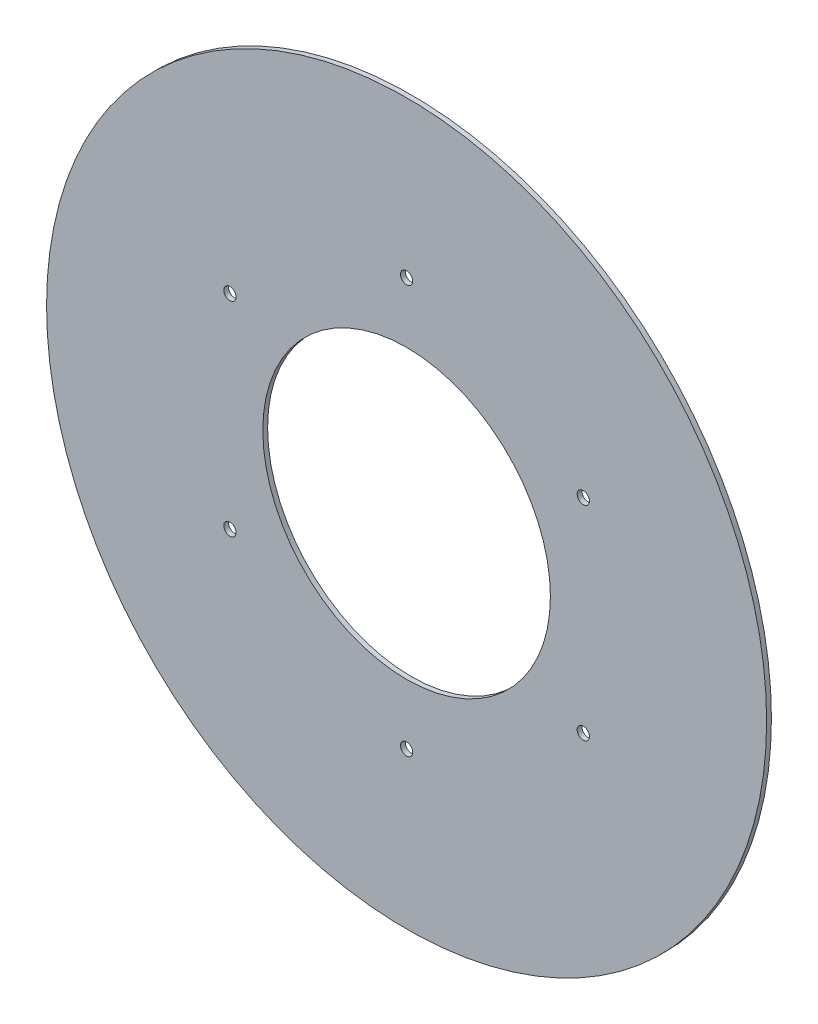
ISO-10303-21;
HEADER;
FILE_DESCRIPTION(('STEP AP214'),'2;1');
FILE_NAME('part.step','',(''),(''),'','','');
FILE_SCHEMA(('AUTOMOTIVE_DESIGN { 1 0 10303 214 1 1 1 1 }'));
ENDSEC;
DATA;
#1=APPLICATION_CONTEXT('core data for automotive mechanical design processes');
#2=APPLICATION_PROTOCOL_DEFINITION('international standard','automotive_design',2000,#1);
#3=PRODUCT_CONTEXT('',#1,'mechanical');
#4=PRODUCT('Part','Part','',(#3));
#5=PRODUCT_RELATED_PRODUCT_CATEGORY('part','',(#4));
#6=PRODUCT_DEFINITION_FORMATION('','',#4);
#7=PRODUCT_DEFINITION_CONTEXT('part definition',#1,'design');
#8=PRODUCT_DEFINITION('design','',#6,#7);
#9=PRODUCT_DEFINITION_SHAPE('','',#8);
#10=(LENGTH_UNIT() NAMED_UNIT(*) SI_UNIT(.MILLI.,.METRE.));
#11=(NAMED_UNIT(*) PLANE_ANGLE_UNIT() SI_UNIT($,.RADIAN.));
#12=(NAMED_UNIT(*) SI_UNIT($,.STERADIAN.) SOLID_ANGLE_UNIT());
#13=UNCERTAINTY_MEASURE_WITH_UNIT(LENGTH_MEASURE(1.E-05),#10,'distance_accuracy_value','');
#14=(GEOMETRIC_REPRESENTATION_CONTEXT(3) GLOBAL_UNCERTAINTY_ASSIGNED_CONTEXT((#13)) GLOBAL_UNIT_ASSIGNED_CONTEXT((#10,
#11,#12)) REPRESENTATION_CONTEXT('',''));
#15=CARTESIAN_POINT('',(0.,0.,0.));
#16=DIRECTION('',(0.,0.,1.));
#17=DIRECTION('',(1.,0.,0.));
#18=AXIS2_PLACEMENT_3D('',#15,#16,#17);
#19=CARTESIAN_POINT('',(0.,0.,513.500012931734));
#20=DIRECTION('',(0.,0.,-1.));
#21=DIRECTION('',(0.,-1.,0.));
#22=AXIS2_PLACEMENT_3D('',#19,#20,#21);
#23=PLANE('',#22);
#24=CARTESIAN_POINT('',(0.,0.,513.500012931734));
#25=DIRECTION('',(0.,0.,-1.));
#26=DIRECTION('',(1.,0.,0.));
#27=AXIS2_PLACEMENT_3D('',#24,#25,#26);
#28=CIRCLE('',#27,119.8125);
#29=CARTESIAN_POINT('',(-119.8125,0.,513.500012931734));
#30=VERTEX_POINT('',#29);
#31=EDGE_CURVE('E81',#30,#30,#28,.T.);
#32=ORIENTED_EDGE('',*,*,#31,.F.);
#33=EDGE_LOOP('',(#32));
#34=FACE_BOUND('',#33,.T.);
#35=CARTESIAN_POINT('',(-147.224319303959,-84.9999988558003,513.500013408569));
#36=DIRECTION('',(0.,0.,-1.));
#37=DIRECTION('',(1.,-7.77181222427865E-09,0.));
#38=AXIS2_PLACEMENT_3D('',#35,#36,#37);
#39=CIRCLE('',#38,5.1);
#40=CARTESIAN_POINT('',(-152.324319303959,-84.999998816164,513.500013408569));
#41=VERTEX_POINT('',#40);
#42=EDGE_CURVE('E62',#41,#41,#39,.T.);
#43=ORIENTED_EDGE('',*,*,#42,.F.);
#44=EDGE_LOOP('',(#43));
#45=FACE_BOUND('',#44,.T.);
#46=CARTESIAN_POINT('',(1.32120806739522E-06,170.,513.500013408569));
#47=DIRECTION('',(0.,0.,-1.));
#48=DIRECTION('',(1.,-7.77181222427866E-09,0.));
#49=AXIS2_PLACEMENT_3D('',#46,#47,#48);
#50=CIRCLE('',#49,5.1);
#51=CARTESIAN_POINT('',(-5.09999867879194,170.000000039636,513.500013408569));
#52=VERTEX_POINT('',#51);
#53=EDGE_CURVE('E134',#52,#52,#50,.T.);
#54=ORIENTED_EDGE('',*,*,#53,.F.);
#55=EDGE_LOOP('',(#54));
#56=FACE_BOUND('',#55,.T.);
#57=CARTESIAN_POINT('',(147.22431798275,-85.0000011441999,513.500013408569));
#58=DIRECTION('',(0.,0.,-1.));
#59=DIRECTION('',(1.,-7.77181222427865E-09,0.));
#60=AXIS2_PLACEMENT_3D('',#57,#58,#59);
#61=CIRCLE('',#60,5.1);
#62=CARTESIAN_POINT('',(142.12431798275,-85.0000011045636,513.500013408569));
#63=VERTEX_POINT('',#62);
#64=EDGE_CURVE('E119',#63,#63,#61,.T.);
#65=ORIENTED_EDGE('',*,*,#64,.F.);
#66=EDGE_LOOP('',(#65));
#67=FACE_BOUND('',#66,.T.);
#68=CARTESIAN_POINT('',(-1.32120811180414E-06,-170.,513.500013408569));
#69=DIRECTION('',(0.,0.,-1.));
#70=DIRECTION('',(1.,-7.77181222427866E-09,0.));
#71=AXIS2_PLACEMENT_3D('',#68,#69,#70);
#72=CIRCLE('',#71,5.1);
#73=CARTESIAN_POINT('',(-5.10000132120812,-169.999999960364,513.500013408569));
#74=VERTEX_POINT('',#73);
#75=EDGE_CURVE('E94',#74,#74,#72,.T.);
#76=ORIENTED_EDGE('',*,*,#75,.F.);
#77=EDGE_LOOP('',(#76));
#78=FACE_BOUND('',#77,.T.);
#79=CARTESIAN_POINT('',(-147.224317982751,85.0000011441997,513.500013408569));
#80=DIRECTION('',(0.,0.,-1.));
#81=DIRECTION('',(1.,-7.77181222427865E-09,0.));
#82=AXIS2_PLACEMENT_3D('',#79,#80,#81);
#83=CIRCLE('',#82,5.1);
#84=CARTESIAN_POINT('',(-152.324317982751,85.0000011838359,513.500013408569));
#85=VERTEX_POINT('',#84);
#86=EDGE_CURVE('E107',#85,#85,#83,.T.);
#87=ORIENTED_EDGE('',*,*,#86,.F.);
#88=EDGE_LOOP('',(#87));
#89=FACE_BOUND('',#88,.T.);
#90=CARTESIAN_POINT('',(147.224319303959,84.9999988558001,513.500013408569));
#91=DIRECTION('',(0.,0.,-1.));
#92=DIRECTION('',(1.,-7.77181222427865E-09,0.));
#93=AXIS2_PLACEMENT_3D('',#90,#91,#92);
#94=CIRCLE('',#93,5.1);
#95=CARTESIAN_POINT('',(142.124319303959,84.9999988954363,513.500013408569));
#96=VERTEX_POINT('',#95);
#97=EDGE_CURVE('E89',#96,#96,#94,.T.);
#98=ORIENTED_EDGE('',*,*,#97,.F.);
#99=EDGE_LOOP('',(#98));
#100=FACE_BOUND('',#99,.T.);
#101=CARTESIAN_POINT('',(0.,0.,513.500012931734));
#102=DIRECTION('',(0.,0.,1.));
#103=DIRECTION('',(-1.,0.,0.));
#104=AXIS2_PLACEMENT_3D('',#101,#102,#103);
#105=CIRCLE('',#104,300.);
#106=CARTESIAN_POINT('',(300.,0.,513.500012931734));
#107=VERTEX_POINT('',#106);
#108=EDGE_CURVE('E11',#107,#107,#105,.T.);
#109=ORIENTED_EDGE('',*,*,#108,.F.);
#110=EDGE_LOOP('',(#109));
#111=FACE_BOUND('',#110,.T.);
#112=ADVANCED_FACE('F17',(#34,#45,#56,#67,#78,#89,#100,#111),#23,.T.);
#113=CARTESIAN_POINT('',(0.,0.,517.500012931734));
#114=DIRECTION('',(0.,0.,-1.));
#115=DIRECTION('',(0.,-1.,0.));
#116=AXIS2_PLACEMENT_3D('',#113,#114,#115);
#117=PLANE('',#116);
#118=CARTESIAN_POINT('',(0.,0.,517.500012931734));
#119=DIRECTION('',(0.,0.,-1.));
#120=DIRECTION('',(1.,0.,0.));
#121=AXIS2_PLACEMENT_3D('',#118,#119,#120);
#122=CIRCLE('',#121,119.8125);
#123=CARTESIAN_POINT('',(-119.8125,0.,517.500012931734));
#124=VERTEX_POINT('',#123);
#125=EDGE_CURVE('E299',#124,#124,#122,.T.);
#126=ORIENTED_EDGE('',*,*,#125,.T.);
#127=EDGE_LOOP('',(#126));
#128=FACE_BOUND('',#127,.T.);
#129=CARTESIAN_POINT('',(147.224319303959,84.9999988558001,517.500012931734));
#130=DIRECTION('',(0.,0.,-1.));
#131=DIRECTION('',(1.,0.,0.));
#132=AXIS2_PLACEMENT_3D('',#129,#130,#131);
#133=CIRCLE('',#132,5.1);
#134=CARTESIAN_POINT('',(142.124319303959,84.9999988558001,517.500012931734));
#135=VERTEX_POINT('',#134);
#136=EDGE_CURVE('E84',#135,#135,#133,.T.);
#137=ORIENTED_EDGE('',*,*,#136,.T.);
#138=EDGE_LOOP('',(#137));
#139=FACE_BOUND('',#138,.T.);
#140=CARTESIAN_POINT('',(-1.32120811180414E-06,-170.,517.500012931734));
#141=DIRECTION('',(0.,0.,-1.));
#142=DIRECTION('',(1.,0.,0.));
#143=AXIS2_PLACEMENT_3D('',#140,#141,#142);
#144=CIRCLE('',#143,5.1);
#145=CARTESIAN_POINT('',(-5.10000132120812,-170.,517.500012931734));
#146=VERTEX_POINT('',#145);
#147=EDGE_CURVE('E111',#146,#146,#144,.T.);
#148=ORIENTED_EDGE('',*,*,#147,.T.);
#149=EDGE_LOOP('',(#148));
#150=FACE_BOUND('',#149,.T.);
#151=CARTESIAN_POINT('',(-147.224319303959,-84.9999988558003,517.500012931734));
#152=DIRECTION('',(0.,0.,-1.));
#153=DIRECTION('',(1.,0.,0.));
#154=AXIS2_PLACEMENT_3D('',#151,#152,#153);
#155=CIRCLE('',#154,5.1);
#156=CARTESIAN_POINT('',(-152.324319303959,-84.9999988558003,517.500012931734));
#157=VERTEX_POINT('',#156);
#158=EDGE_CURVE('E75',#157,#157,#155,.T.);
#159=ORIENTED_EDGE('',*,*,#158,.T.);
#160=EDGE_LOOP('',(#159));
#161=FACE_BOUND('',#160,.T.);
#162=CARTESIAN_POINT('',(-147.224317982751,85.0000011441997,517.500012931734));
#163=DIRECTION('',(0.,0.,-1.));
#164=DIRECTION('',(1.,0.,0.));
#165=AXIS2_PLACEMENT_3D('',#162,#163,#164);
#166=CIRCLE('',#165,5.1);
#167=CARTESIAN_POINT('',(-152.324317982751,85.0000011441997,517.500012931734));
#168=VERTEX_POINT('',#167);
#169=EDGE_CURVE('E93',#168,#168,#166,.T.);
#170=ORIENTED_EDGE('',*,*,#169,.T.);
#171=EDGE_LOOP('',(#170));
#172=FACE_BOUND('',#171,.T.);
#173=CARTESIAN_POINT('',(147.22431798275,-85.0000011441999,517.500012931734));
#174=DIRECTION('',(0.,0.,-1.));
#175=DIRECTION('',(1.,0.,0.));
#176=AXIS2_PLACEMENT_3D('',#173,#174,#175);
#177=CIRCLE('',#176,5.1);
#178=CARTESIAN_POINT('',(142.12431798275,-85.0000011441999,517.500012931734));
#179=VERTEX_POINT('',#178);
#180=EDGE_CURVE('E98',#179,#179,#177,.T.);
#181=ORIENTED_EDGE('',*,*,#180,.T.);
#182=EDGE_LOOP('',(#181));
#183=FACE_BOUND('',#182,.T.);
#184=CARTESIAN_POINT('',(1.32120806739522E-06,170.,517.500012931734));
#185=DIRECTION('',(0.,0.,-1.));
#186=DIRECTION('',(1.,0.,0.));
#187=AXIS2_PLACEMENT_3D('',#184,#185,#186);
#188=CIRCLE('',#187,5.1);
#189=CARTESIAN_POINT('',(-5.09999867879195,170.,517.500012931734));
#190=VERTEX_POINT('',#189);
#191=EDGE_CURVE('E126',#190,#190,#188,.T.);
#192=ORIENTED_EDGE('',*,*,#191,.T.);
#193=EDGE_LOOP('',(#192));
#194=FACE_BOUND('',#193,.T.);
#195=CARTESIAN_POINT('',(0.,0.,517.500012931734));
#196=DIRECTION('',(0.,0.,1.));
#197=DIRECTION('',(-1.,0.,0.));
#198=AXIS2_PLACEMENT_3D('',#195,#196,#197);
#199=CIRCLE('',#198,300.);
#200=CARTESIAN_POINT('',(300.,0.,517.500012931734));
#201=VERTEX_POINT('',#200);
#202=EDGE_CURVE('E66',#201,#201,#199,.T.);
#203=ORIENTED_EDGE('',*,*,#202,.T.);
#204=EDGE_LOOP('',(#203));
#205=FACE_BOUND('',#204,.T.);
#206=ADVANCED_FACE('F19',(#128,#139,#150,#161,#172,#183,#194,#205),#117,.F.);
#207=CARTESIAN_POINT('',(0.,0.,513.500012931734));
#208=DIRECTION('',(0.,0.,1.));
#209=DIRECTION('',(-1.,0.,0.));
#210=AXIS2_PLACEMENT_3D('',#207,#208,#209);
#211=CYLINDRICAL_SURFACE('',#210,300.);
#212=ORIENTED_EDGE('',*,*,#202,.F.);
#213=DIRECTION('',(0.,0.,-1.));
#214=VECTOR('',#213,1.);
#215=CARTESIAN_POINT('',(300.,0.,513.500012931734));
#216=LINE('',#215,#214);
#217=EDGE_CURVE('E21',#201,#107,#216,.T.);
#218=ORIENTED_EDGE('',*,*,#217,.T.);
#219=ORIENTED_EDGE('',*,*,#108,.T.);
#220=ORIENTED_EDGE('',*,*,#217,.F.);
#221=EDGE_LOOP('',(#212,#218,#219,#220));
#222=FACE_BOUND('',#221,.T.);
#223=ADVANCED_FACE('F142',(#222),#211,.T.);
#224=CARTESIAN_POINT('',(-147.224319303959,-84.9999988558003,517.500029491426));
#225=DIRECTION('',(0.,0.,-1.));
#226=DIRECTION('',(1.,-7.77181222427865E-09,0.));
#227=AXIS2_PLACEMENT_3D('',#224,#225,#226);
#228=CYLINDRICAL_SURFACE('',#227,5.1);
#229=ORIENTED_EDGE('',*,*,#158,.F.);
#230=DIRECTION('',(0.,0.,-1.));
#231=VECTOR('',#230,1.);
#232=CARTESIAN_POINT('',(-152.324319303959,-84.999998816164,517.500029491426));
#233=LINE('',#232,#231);
#234=EDGE_CURVE('E57',#157,#41,#233,.T.);
#235=ORIENTED_EDGE('',*,*,#234,.T.);
#236=ORIENTED_EDGE('',*,*,#42,.T.);
#237=ORIENTED_EDGE('',*,*,#234,.F.);
#238=EDGE_LOOP('',(#229,#235,#236,#237));
#239=FACE_BOUND('',#238,.T.);
#240=ADVANCED_FACE('F63',(#239),#228,.F.);
#241=CARTESIAN_POINT('',(1.32120806739522E-06,170.,517.500029491426));
#242=DIRECTION('',(0.,0.,-1.));
#243=DIRECTION('',(1.,-7.77181222427866E-09,0.));
#244=AXIS2_PLACEMENT_3D('',#241,#242,#243);
#245=CYLINDRICAL_SURFACE('',#244,5.1);
#246=ORIENTED_EDGE('',*,*,#191,.F.);
#247=DIRECTION('',(0.,0.,-1.));
#248=VECTOR('',#247,1.);
#249=CARTESIAN_POINT('',(-5.09999867879194,170.000000039636,517.500029491426));
#250=LINE('',#249,#248);
#251=EDGE_CURVE('E130',#190,#52,#250,.T.);
#252=ORIENTED_EDGE('',*,*,#251,.T.);
#253=ORIENTED_EDGE('',*,*,#53,.T.);
#254=ORIENTED_EDGE('',*,*,#251,.F.);
#255=EDGE_LOOP('',(#246,#252,#253,#254));
#256=FACE_BOUND('',#255,.T.);
#257=ADVANCED_FACE('F198',(#256),#245,.F.);
#258=CARTESIAN_POINT('',(147.22431798275,-85.0000011441999,517.500029491426));
#259=DIRECTION('',(0.,0.,-1.));
#260=DIRECTION('',(1.,-7.77181222427865E-09,0.));
#261=AXIS2_PLACEMENT_3D('',#258,#259,#260);
#262=CYLINDRICAL_SURFACE('',#261,5.1);
#263=ORIENTED_EDGE('',*,*,#180,.F.);
#264=DIRECTION('',(0.,0.,-1.));
#265=VECTOR('',#264,1.);
#266=CARTESIAN_POINT('',(142.12431798275,-85.0000011045636,517.500029491426));
#267=LINE('',#266,#265);
#268=EDGE_CURVE('E115',#179,#63,#267,.T.);
#269=ORIENTED_EDGE('',*,*,#268,.T.);
#270=ORIENTED_EDGE('',*,*,#64,.T.);
#271=ORIENTED_EDGE('',*,*,#268,.F.);
#272=EDGE_LOOP('',(#263,#269,#270,#271));
#273=FACE_BOUND('',#272,.T.);
#274=ADVANCED_FACE('F192',(#273),#262,.F.);
#275=CARTESIAN_POINT('',(-1.32120811180414E-06,-170.,517.500029491426));
#276=DIRECTION('',(0.,0.,-1.));
#277=DIRECTION('',(1.,-7.77181222427866E-09,0.));
#278=AXIS2_PLACEMENT_3D('',#275,#276,#277);
#279=CYLINDRICAL_SURFACE('',#278,5.1);
#280=ORIENTED_EDGE('',*,*,#147,.F.);
#281=DIRECTION('',(0.,0.,-1.));
#282=VECTOR('',#281,1.);
#283=CARTESIAN_POINT('',(-5.10000132120812,-169.999999960364,517.500029491426));
#284=LINE('',#283,#282);
#285=EDGE_CURVE('E99',#146,#74,#284,.T.);
#286=ORIENTED_EDGE('',*,*,#285,.T.);
#287=ORIENTED_EDGE('',*,*,#75,.T.);
#288=ORIENTED_EDGE('',*,*,#285,.F.);
#289=EDGE_LOOP('',(#280,#286,#287,#288));
#290=FACE_BOUND('',#289,.T.);
#291=ADVANCED_FACE('F183',(#290),#279,.F.);
#292=CARTESIAN_POINT('',(-147.224317982751,85.0000011441997,517.500029491426));
#293=DIRECTION('',(0.,0.,-1.));
#294=DIRECTION('',(1.,-7.77181222427865E-09,0.));
#295=AXIS2_PLACEMENT_3D('',#292,#293,#294);
#296=CYLINDRICAL_SURFACE('',#295,5.1);
#297=ORIENTED_EDGE('',*,*,#169,.F.);
#298=DIRECTION('',(0.,0.,-1.));
#299=VECTOR('',#298,1.);
#300=CARTESIAN_POINT('',(-152.324317982751,85.0000011838359,517.500029491426));
#301=LINE('',#300,#299);
#302=EDGE_CURVE('E103',#168,#85,#301,.T.);
#303=ORIENTED_EDGE('',*,*,#302,.T.);
#304=ORIENTED_EDGE('',*,*,#86,.T.);
#305=ORIENTED_EDGE('',*,*,#302,.F.);
#306=EDGE_LOOP('',(#297,#303,#304,#305));
#307=FACE_BOUND('',#306,.T.);
#308=ADVANCED_FACE('F174',(#307),#296,.F.);
#309=CARTESIAN_POINT('',(147.224319303959,84.9999988558001,517.500029491426));
#310=DIRECTION('',(0.,0.,-1.));
#311=DIRECTION('',(1.,-7.77181222427865E-09,0.));
#312=AXIS2_PLACEMENT_3D('',#309,#310,#311);
#313=CYLINDRICAL_SURFACE('',#312,5.1);
#314=ORIENTED_EDGE('',*,*,#136,.F.);
#315=DIRECTION('',(0.,0.,-1.));
#316=VECTOR('',#315,1.);
#317=CARTESIAN_POINT('',(142.124319303959,84.9999988954363,517.500029491426));
#318=LINE('',#317,#316);
#319=EDGE_CURVE('E79',#135,#96,#318,.T.);
#320=ORIENTED_EDGE('',*,*,#319,.T.);
#321=ORIENTED_EDGE('',*,*,#97,.T.);
#322=ORIENTED_EDGE('',*,*,#319,.F.);
#323=EDGE_LOOP('',(#314,#320,#321,#322));
#324=FACE_BOUND('',#323,.T.);
#325=ADVANCED_FACE('F164',(#324),#313,.F.);
#326=CARTESIAN_POINT('',(0.,0.,513.500012931734));
#327=DIRECTION('',(0.,0.,1.));
#328=DIRECTION('',(1.,0.,0.));
#329=AXIS2_PLACEMENT_3D('',#326,#327,#328);
#330=CYLINDRICAL_SURFACE('',#329,119.8125);
#331=ORIENTED_EDGE('',*,*,#125,.F.);
#332=DIRECTION('',(0.,0.,-1.));
#333=VECTOR('',#332,1.);
#334=CARTESIAN_POINT('',(-119.8125,0.,513.500012931734));
#335=LINE('',#334,#333);
#336=EDGE_CURVE('E85',#124,#30,#335,.T.);
#337=ORIENTED_EDGE('',*,*,#336,.T.);
#338=ORIENTED_EDGE('',*,*,#31,.T.);
#339=ORIENTED_EDGE('',*,*,#336,.F.);
#340=EDGE_LOOP('',(#331,#337,#338,#339));
#341=FACE_BOUND('',#340,.T.);
#342=ADVANCED_FACE('F159',(#341),#330,.F.);
#343=CLOSED_SHELL('',(#112,#206,#223,#240,#257,#274,#291,#308,#325,#342));
#344=MANIFOLD_SOLID_BREP('B1',#343);
#345=ADVANCED_BREP_SHAPE_REPRESENTATION('',(#18,#344),#14);
#346=SHAPE_DEFINITION_REPRESENTATION(#9,#345);
ENDSEC;
END-ISO-10303-21;
